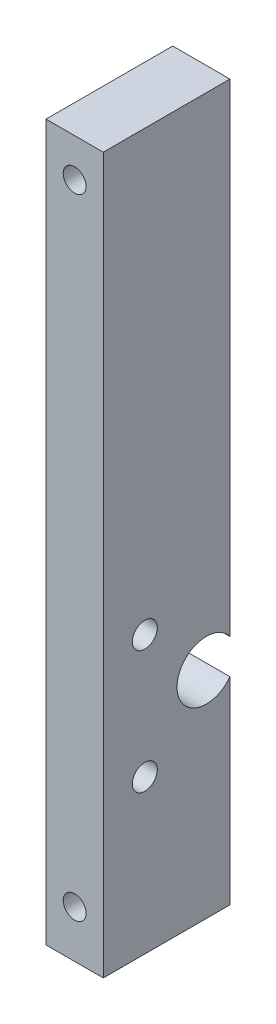
ISO-10303-21;
HEADER;
FILE_DESCRIPTION(('STEP AP214'),'2;1');
FILE_NAME('part.step','',(''),(''),'','','');
FILE_SCHEMA(('AUTOMOTIVE_DESIGN { 1 0 10303 214 1 1 1 1 }'));
ENDSEC;
DATA;
#1=APPLICATION_CONTEXT('core data for automotive mechanical design processes');
#2=APPLICATION_PROTOCOL_DEFINITION('international standard','automotive_design',2000,#1);
#3=PRODUCT_CONTEXT('',#1,'mechanical');
#4=PRODUCT('Part','Part','',(#3));
#5=PRODUCT_RELATED_PRODUCT_CATEGORY('part','',(#4));
#6=PRODUCT_DEFINITION_FORMATION('','',#4);
#7=PRODUCT_DEFINITION_CONTEXT('part definition',#1,'design');
#8=PRODUCT_DEFINITION('design','',#6,#7);
#9=PRODUCT_DEFINITION_SHAPE('','',#8);
#10=(LENGTH_UNIT() NAMED_UNIT(*) SI_UNIT(.MILLI.,.METRE.));
#11=(NAMED_UNIT(*) PLANE_ANGLE_UNIT() SI_UNIT($,.RADIAN.));
#12=(NAMED_UNIT(*) SI_UNIT($,.STERADIAN.) SOLID_ANGLE_UNIT());
#13=UNCERTAINTY_MEASURE_WITH_UNIT(LENGTH_MEASURE(1.E-05),#10,'distance_accuracy_value','');
#14=(GEOMETRIC_REPRESENTATION_CONTEXT(3) GLOBAL_UNCERTAINTY_ASSIGNED_CONTEXT((#13)) GLOBAL_UNIT_ASSIGNED_CONTEXT((#10,
#11,#12)) REPRESENTATION_CONTEXT('',''));
#15=CARTESIAN_POINT('',(0.,0.,0.));
#16=DIRECTION('',(0.,0.,1.));
#17=DIRECTION('',(1.,0.,0.));
#18=AXIS2_PLACEMENT_3D('',#15,#16,#17);
#19=CARTESIAN_POINT('',(0.,0.,2.248090434488));
#20=DIRECTION('',(0.,0.,-1.));
#21=DIRECTION('',(-1.,0.,0.));
#22=AXIS2_PLACEMENT_3D('',#19,#20,#21);
#23=PLANE('',#22);
#24=DIRECTION('',(-1.,0.,0.));
#25=VECTOR('',#24,1.);
#26=CARTESIAN_POINT('',(-0.3,9.51035660493057,2.248090434488));
#27=LINE('',#26,#25);
#28=CARTESIAN_POINT('',(-0.3,9.51035660493057,2.248090434488));
#29=VERTEX_POINT('',#28);
#30=CARTESIAN_POINT('',(-4.3,9.51035660493057,2.248090434488));
#31=VERTEX_POINT('',#30);
#32=EDGE_CURVE('E11',#29,#31,#27,.T.);
#33=ORIENTED_EDGE('',*,*,#32,.F.);
#34=DIRECTION('',(0.,1.,0.));
#35=VECTOR('',#34,1.);
#36=CARTESIAN_POINT('',(-0.3,-4.3,2.248090434488));
#37=LINE('',#36,#35);
#38=CARTESIAN_POINT('',(-0.3,-4.3,2.248090434488));
#39=VERTEX_POINT('',#38);
#40=EDGE_CURVE('E143',#39,#29,#37,.T.);
#41=ORIENTED_EDGE('',*,*,#40,.F.);
#42=DIRECTION('',(1.,0.,0.));
#43=VECTOR('',#42,1.);
#44=CARTESIAN_POINT('',(-4.3,-4.3,2.248090434488));
#45=LINE('',#44,#43);
#46=CARTESIAN_POINT('',(-4.3,-4.3,2.248090434488));
#47=VERTEX_POINT('',#46);
#48=EDGE_CURVE('E126',#47,#39,#45,.T.);
#49=ORIENTED_EDGE('',*,*,#48,.F.);
#50=DIRECTION('',(0.,-1.,0.));
#51=VECTOR('',#50,1.);
#52=CARTESIAN_POINT('',(-4.3,-4.3,2.248090434488));
#53=LINE('',#52,#51);
#54=EDGE_CURVE('E118',#31,#47,#53,.T.);
#55=ORIENTED_EDGE('',*,*,#54,.F.);
#56=EDGE_LOOP('',(#33,#41,#49,#55));
#57=FACE_BOUND('',#56,.T.);
#58=CARTESIAN_POINT('',(-2.3,-1.,2.248090434488));
#59=DIRECTION('',(0.,0.,1.));
#60=DIRECTION('',(1.,0.,0.));
#61=AXIS2_PLACEMENT_3D('',#58,#59,#60);
#62=CIRCLE('',#61,0.8);
#63=CARTESIAN_POINT('',(-1.5,-1.,2.248090434488));
#64=VERTEX_POINT('',#63);
#65=EDGE_CURVE('E128',#64,#64,#62,.T.);
#66=ORIENTED_EDGE('',*,*,#65,.T.);
#67=EDGE_LOOP('',(#66));
#68=FACE_BOUND('',#67,.T.);
#69=ADVANCED_FACE('F47',(#57,#68),#23,.T.);
#70=CARTESIAN_POINT('',(-4.3,-4.3,11.1));
#71=DIRECTION('',(1.,0.,0.));
#72=DIRECTION('',(0.,0.,-1.));
#73=AXIS2_PLACEMENT_3D('',#70,#71,#72);
#74=PLANE('',#73);
#75=CARTESIAN_POINT('',(-4.3,6.425,8.1994963273));
#76=DIRECTION('',(-1.,0.,0.));
#77=DIRECTION('',(0.,0.,1.));
#78=AXIS2_PLACEMENT_3D('',#75,#76,#77);
#79=CIRCLE('',#78,0.875000000000001);
#80=CARTESIAN_POINT('',(-4.3,6.425,9.0744963273));
#81=VERTEX_POINT('',#80);
#82=EDGE_CURVE('E192',#81,#81,#79,.T.);
#83=ORIENTED_EDGE('',*,*,#82,.F.);
#84=EDGE_LOOP('',(#83));
#85=FACE_BOUND('',#84,.T.);
#86=CARTESIAN_POINT('',(-4.3,15.025,8.1994963273));
#87=DIRECTION('',(-1.,0.,0.));
#88=DIRECTION('',(0.,0.,1.));
#89=AXIS2_PLACEMENT_3D('',#86,#87,#88);
#90=CIRCLE('',#89,0.875000000000001);
#91=CARTESIAN_POINT('',(-4.3,15.025,9.0744963273));
#92=VERTEX_POINT('',#91);
#93=EDGE_CURVE('E186',#92,#92,#90,.T.);
#94=ORIENTED_EDGE('',*,*,#93,.F.);
#95=EDGE_LOOP('',(#94));
#96=FACE_BOUND('',#95,.T.);
#97=CARTESIAN_POINT('',(-4.3,45.68,2.248090434488));
#98=VERTEX_POINT('',#97);
#99=CARTESIAN_POINT('',(-4.3,11.9396433950694,2.248090434488));
#100=VERTEX_POINT('',#99);
#101=EDGE_CURVE('E121',#98,#100,#53,.T.);
#102=ORIENTED_EDGE('',*,*,#101,.T.);
#103=CARTESIAN_POINT('',(-4.3,10.725,3.8994963273));
#104=DIRECTION('',(-1.,0.,0.));
#105=DIRECTION('',(0.,0.,1.));
#106=AXIS2_PLACEMENT_3D('',#103,#104,#105);
#107=CIRCLE('',#106,2.05);
#108=EDGE_CURVE('E62',#31,#100,#107,.T.);
#109=ORIENTED_EDGE('',*,*,#108,.F.);
#110=ORIENTED_EDGE('',*,*,#54,.T.);
#111=DIRECTION('',(0.,0.,-1.));
#112=VECTOR('',#111,1.);
#113=CARTESIAN_POINT('',(-4.3,-4.3,11.1));
#114=LINE('',#113,#112);
#115=CARTESIAN_POINT('',(-4.3,-4.3,11.1));
#116=VERTEX_POINT('',#115);
#117=EDGE_CURVE('E159',#116,#47,#114,.T.);
#118=ORIENTED_EDGE('',*,*,#117,.F.);
#119=DIRECTION('',(0.,-1.,0.));
#120=VECTOR('',#119,1.);
#121=CARTESIAN_POINT('',(-4.3,-4.3,11.1));
#122=LINE('',#121,#120);
#123=CARTESIAN_POINT('',(-4.3,45.68,11.1));
#124=VERTEX_POINT('',#123);
#125=EDGE_CURVE('E148',#124,#116,#122,.T.);
#126=ORIENTED_EDGE('',*,*,#125,.F.);
#127=DIRECTION('',(0.,0.,-1.));
#128=VECTOR('',#127,1.);
#129=CARTESIAN_POINT('',(-4.3,45.68,11.1));
#130=LINE('',#129,#128);
#131=EDGE_CURVE('E149',#124,#98,#130,.T.);
#132=ORIENTED_EDGE('',*,*,#131,.T.);
#133=EDGE_LOOP('',(#102,#109,#110,#118,#126,#132));
#134=FACE_BOUND('',#133,.T.);
#135=ADVANCED_FACE('F49',(#85,#96,#134),#74,.F.);
#136=CARTESIAN_POINT('',(-4.3,-4.3,11.1));
#137=DIRECTION('',(0.,1.,0.));
#138=DIRECTION('',(0.,0.,1.));
#139=AXIS2_PLACEMENT_3D('',#136,#137,#138);
#140=PLANE('',#139);
#141=ORIENTED_EDGE('',*,*,#48,.T.);
#142=DIRECTION('',(0.,0.,-1.));
#143=VECTOR('',#142,1.);
#144=CARTESIAN_POINT('',(-0.3,-4.3,11.1));
#145=LINE('',#144,#143);
#146=CARTESIAN_POINT('',(-0.3,-4.3,11.1));
#147=VERTEX_POINT('',#146);
#148=EDGE_CURVE('E155',#147,#39,#145,.T.);
#149=ORIENTED_EDGE('',*,*,#148,.F.);
#150=DIRECTION('',(1.,0.,0.));
#151=VECTOR('',#150,1.);
#152=CARTESIAN_POINT('',(-4.3,-4.3,11.1));
#153=LINE('',#152,#151);
#154=EDGE_CURVE('E100',#116,#147,#153,.T.);
#155=ORIENTED_EDGE('',*,*,#154,.F.);
#156=ORIENTED_EDGE('',*,*,#117,.T.);
#157=EDGE_LOOP('',(#141,#149,#155,#156));
#158=FACE_BOUND('',#157,.T.);
#159=ADVANCED_FACE('F218',(#158),#140,.F.);
#160=CARTESIAN_POINT('',(-0.3,-4.3,11.1));
#161=DIRECTION('',(-1.,0.,0.));
#162=DIRECTION('',(0.,0.,1.));
#163=AXIS2_PLACEMENT_3D('',#160,#161,#162);
#164=PLANE('',#163);
#165=CARTESIAN_POINT('',(-0.3,6.425,8.1994963273));
#166=DIRECTION('',(-1.,0.,0.));
#167=DIRECTION('',(0.,0.,1.));
#168=AXIS2_PLACEMENT_3D('',#165,#166,#167);
#169=CIRCLE('',#168,0.875000000000001);
#170=CARTESIAN_POINT('',(-0.3,6.425,9.0744963273));
#171=VERTEX_POINT('',#170);
#172=EDGE_CURVE('E123',#171,#171,#169,.T.);
#173=ORIENTED_EDGE('',*,*,#172,.T.);
#174=EDGE_LOOP('',(#173));
#175=FACE_BOUND('',#174,.T.);
#176=CARTESIAN_POINT('',(-0.3,15.025,8.1994963273));
#177=DIRECTION('',(-1.,0.,0.));
#178=DIRECTION('',(0.,0.,1.));
#179=AXIS2_PLACEMENT_3D('',#176,#177,#178);
#180=CIRCLE('',#179,0.875000000000001);
#181=CARTESIAN_POINT('',(-0.3,15.025,9.0744963273));
#182=VERTEX_POINT('',#181);
#183=EDGE_CURVE('E184',#182,#182,#180,.T.);
#184=ORIENTED_EDGE('',*,*,#183,.T.);
#185=EDGE_LOOP('',(#184));
#186=FACE_BOUND('',#185,.T.);
#187=ORIENTED_EDGE('',*,*,#40,.T.);
#188=CARTESIAN_POINT('',(-0.3,10.725,3.8994963273));
#189=DIRECTION('',(-1.,0.,0.));
#190=DIRECTION('',(0.,0.,1.));
#191=AXIS2_PLACEMENT_3D('',#188,#189,#190);
#192=CIRCLE('',#191,2.05);
#193=CARTESIAN_POINT('',(-0.3,11.9396433950694,2.248090434488));
#194=VERTEX_POINT('',#193);
#195=EDGE_CURVE('E110',#29,#194,#192,.T.);
#196=ORIENTED_EDGE('',*,*,#195,.T.);
#197=CARTESIAN_POINT('',(-0.3,45.68,2.248090434488));
#198=VERTEX_POINT('',#197);
#199=EDGE_CURVE('E142',#194,#198,#37,.T.);
#200=ORIENTED_EDGE('',*,*,#199,.T.);
#201=DIRECTION('',(0.,0.,-1.));
#202=VECTOR('',#201,1.);
#203=CARTESIAN_POINT('',(-0.3,45.68,11.1));
#204=LINE('',#203,#202);
#205=CARTESIAN_POINT('',(-0.3,45.68,11.1));
#206=VERTEX_POINT('',#205);
#207=EDGE_CURVE('E152',#206,#198,#204,.T.);
#208=ORIENTED_EDGE('',*,*,#207,.F.);
#209=DIRECTION('',(0.,1.,0.));
#210=VECTOR('',#209,1.);
#211=CARTESIAN_POINT('',(-0.3,-4.3,11.1));
#212=LINE('',#211,#210);
#213=EDGE_CURVE('E179',#147,#206,#212,.T.);
#214=ORIENTED_EDGE('',*,*,#213,.F.);
#215=ORIENTED_EDGE('',*,*,#148,.T.);
#216=EDGE_LOOP('',(#187,#196,#200,#208,#214,#215));
#217=FACE_BOUND('',#216,.T.);
#218=ADVANCED_FACE('F164',(#175,#186,#217),#164,.F.);
#219=CARTESIAN_POINT('',(-4.3,45.68,11.1));
#220=DIRECTION('',(0.,-1.,0.));
#221=DIRECTION('',(0.,0.,-1.));
#222=AXIS2_PLACEMENT_3D('',#219,#220,#221);
#223=PLANE('',#222);
#224=DIRECTION('',(-1.,0.,0.));
#225=VECTOR('',#224,1.);
#226=CARTESIAN_POINT('',(-4.3,45.68,2.248090434488));
#227=LINE('',#226,#225);
#228=EDGE_CURVE('E92',#198,#98,#227,.T.);
#229=ORIENTED_EDGE('',*,*,#228,.T.);
#230=ORIENTED_EDGE('',*,*,#131,.F.);
#231=DIRECTION('',(-1.,0.,0.));
#232=VECTOR('',#231,1.);
#233=CARTESIAN_POINT('',(-4.3,45.68,11.1));
#234=LINE('',#233,#232);
#235=EDGE_CURVE('E71',#206,#124,#234,.T.);
#236=ORIENTED_EDGE('',*,*,#235,.F.);
#237=ORIENTED_EDGE('',*,*,#207,.T.);
#238=EDGE_LOOP('',(#229,#230,#236,#237));
#239=FACE_BOUND('',#238,.T.);
#240=ADVANCED_FACE('F241',(#239),#223,.F.);
#241=CARTESIAN_POINT('',(0.,0.,11.1));
#242=DIRECTION('',(0.,0.,-1.));
#243=DIRECTION('',(-1.,0.,0.));
#244=AXIS2_PLACEMENT_3D('',#241,#242,#243);
#245=PLANE('',#244);
#246=CARTESIAN_POINT('',(-2.3,-1.,11.1));
#247=DIRECTION('',(0.,0.,1.));
#248=DIRECTION('',(1.,0.,0.));
#249=AXIS2_PLACEMENT_3D('',#246,#247,#248);
#250=CIRCLE('',#249,0.8);
#251=CARTESIAN_POINT('',(-1.5,-1.,11.1));
#252=VERTEX_POINT('',#251);
#253=EDGE_CURVE('E135',#252,#252,#250,.T.);
#254=ORIENTED_EDGE('',*,*,#253,.F.);
#255=EDGE_LOOP('',(#254));
#256=FACE_BOUND('',#255,.T.);
#257=CARTESIAN_POINT('',(-2.3,43.,11.1));
#258=DIRECTION('',(0.,0.,1.));
#259=DIRECTION('',(1.,0.,0.));
#260=AXIS2_PLACEMENT_3D('',#257,#258,#259);
#261=CIRCLE('',#260,0.8);
#262=CARTESIAN_POINT('',(-1.5,43.,11.1));
#263=VERTEX_POINT('',#262);
#264=EDGE_CURVE('E175',#263,#263,#261,.T.);
#265=ORIENTED_EDGE('',*,*,#264,.F.);
#266=EDGE_LOOP('',(#265));
#267=FACE_BOUND('',#266,.T.);
#268=ORIENTED_EDGE('',*,*,#125,.T.);
#269=ORIENTED_EDGE('',*,*,#154,.T.);
#270=ORIENTED_EDGE('',*,*,#213,.T.);
#271=ORIENTED_EDGE('',*,*,#235,.T.);
#272=EDGE_LOOP('',(#268,#269,#270,#271));
#273=FACE_BOUND('',#272,.T.);
#274=ADVANCED_FACE('F235',(#256,#267,#273),#245,.F.);
#275=DIRECTION('',(-1.,0.,0.));
#276=VECTOR('',#275,1.);
#277=CARTESIAN_POINT('',(-0.3,11.9396433950694,2.248090434488));
#278=LINE('',#277,#276);
#279=EDGE_CURVE('E56',#100,#194,#278,.F.);
#280=ORIENTED_EDGE('',*,*,#279,.F.);
#281=ORIENTED_EDGE('',*,*,#101,.F.);
#282=ORIENTED_EDGE('',*,*,#228,.F.);
#283=ORIENTED_EDGE('',*,*,#199,.F.);
#284=EDGE_LOOP('',(#280,#281,#282,#283));
#285=FACE_BOUND('',#284,.T.);
#286=CARTESIAN_POINT('',(-2.3,43.,2.248090434488));
#287=DIRECTION('',(0.,0.,1.));
#288=DIRECTION('',(1.,0.,0.));
#289=AXIS2_PLACEMENT_3D('',#286,#287,#288);
#290=CIRCLE('',#289,0.8);
#291=CARTESIAN_POINT('',(-1.5,43.,2.248090434488));
#292=VERTEX_POINT('',#291);
#293=EDGE_CURVE('E167',#292,#292,#290,.T.);
#294=ORIENTED_EDGE('',*,*,#293,.T.);
#295=EDGE_LOOP('',(#294));
#296=FACE_BOUND('',#295,.T.);
#297=ADVANCED_FACE('F169',(#285,#296),#23,.T.);
#298=CARTESIAN_POINT('',(-2.3,43.,2.248090434488));
#299=DIRECTION('',(0.,0.,1.));
#300=DIRECTION('',(1.,0.,0.));
#301=AXIS2_PLACEMENT_3D('',#298,#299,#300);
#302=CYLINDRICAL_SURFACE('',#301,0.8);
#303=ORIENTED_EDGE('',*,*,#293,.F.);
#304=EDGE_LOOP('',(#303));
#305=FACE_BOUND('',#304,.T.);
#306=ORIENTED_EDGE('',*,*,#264,.T.);
#307=EDGE_LOOP('',(#306));
#308=FACE_BOUND('',#307,.T.);
#309=ADVANCED_FACE('F234',(#305,#308),#302,.F.);
#310=CARTESIAN_POINT('',(-2.3,-1.,2.248090434488));
#311=DIRECTION('',(0.,0.,1.));
#312=DIRECTION('',(1.,0.,0.));
#313=AXIS2_PLACEMENT_3D('',#310,#311,#312);
#314=CYLINDRICAL_SURFACE('',#313,0.8);
#315=ORIENTED_EDGE('',*,*,#65,.F.);
#316=EDGE_LOOP('',(#315));
#317=FACE_BOUND('',#316,.T.);
#318=ORIENTED_EDGE('',*,*,#253,.T.);
#319=EDGE_LOOP('',(#318));
#320=FACE_BOUND('',#319,.T.);
#321=ADVANCED_FACE('F226',(#317,#320),#314,.F.);
#322=CARTESIAN_POINT('',(-0.3,10.725,3.8994963273));
#323=DIRECTION('',(-1.,0.,0.));
#324=DIRECTION('',(0.,0.,1.));
#325=AXIS2_PLACEMENT_3D('',#322,#323,#324);
#326=CYLINDRICAL_SURFACE('',#325,2.05);
#327=ORIENTED_EDGE('',*,*,#32,.T.);
#328=ORIENTED_EDGE('',*,*,#108,.T.);
#329=ORIENTED_EDGE('',*,*,#279,.T.);
#330=ORIENTED_EDGE('',*,*,#195,.F.);
#331=EDGE_LOOP('',(#327,#328,#329,#330));
#332=FACE_BOUND('',#331,.T.);
#333=ADVANCED_FACE('F108',(#332),#326,.F.);
#334=CARTESIAN_POINT('',(-0.3,15.025,8.1994963273));
#335=DIRECTION('',(-1.,0.,0.));
#336=DIRECTION('',(0.,0.,1.));
#337=AXIS2_PLACEMENT_3D('',#334,#335,#336);
#338=CYLINDRICAL_SURFACE('',#337,0.875000000000001);
#339=ORIENTED_EDGE('',*,*,#183,.F.);
#340=EDGE_LOOP('',(#339));
#341=FACE_BOUND('',#340,.T.);
#342=ORIENTED_EDGE('',*,*,#93,.T.);
#343=EDGE_LOOP('',(#342));
#344=FACE_BOUND('',#343,.T.);
#345=ADVANCED_FACE('F212',(#341,#344),#338,.F.);
#346=CARTESIAN_POINT('',(-0.3,6.425,8.1994963273));
#347=DIRECTION('',(-1.,0.,0.));
#348=DIRECTION('',(0.,0.,1.));
#349=AXIS2_PLACEMENT_3D('',#346,#347,#348);
#350=CYLINDRICAL_SURFACE('',#349,0.875000000000001);
#351=ORIENTED_EDGE('',*,*,#172,.F.);
#352=EDGE_LOOP('',(#351));
#353=FACE_BOUND('',#352,.T.);
#354=ORIENTED_EDGE('',*,*,#82,.T.);
#355=EDGE_LOOP('',(#354));
#356=FACE_BOUND('',#355,.T.);
#357=ADVANCED_FACE('F209',(#353,#356),#350,.F.);
#358=CLOSED_SHELL('',(#69,#135,#159,#218,#240,#274,#297,#309,#321,#333,#345,#357));
#359=MANIFOLD_SOLID_BREP('B2',#358);
#360=ADVANCED_BREP_SHAPE_REPRESENTATION('',(#18,#359),#14);
#361=SHAPE_DEFINITION_REPRESENTATION(#9,#360);
ENDSEC;
END-ISO-10303-21;
